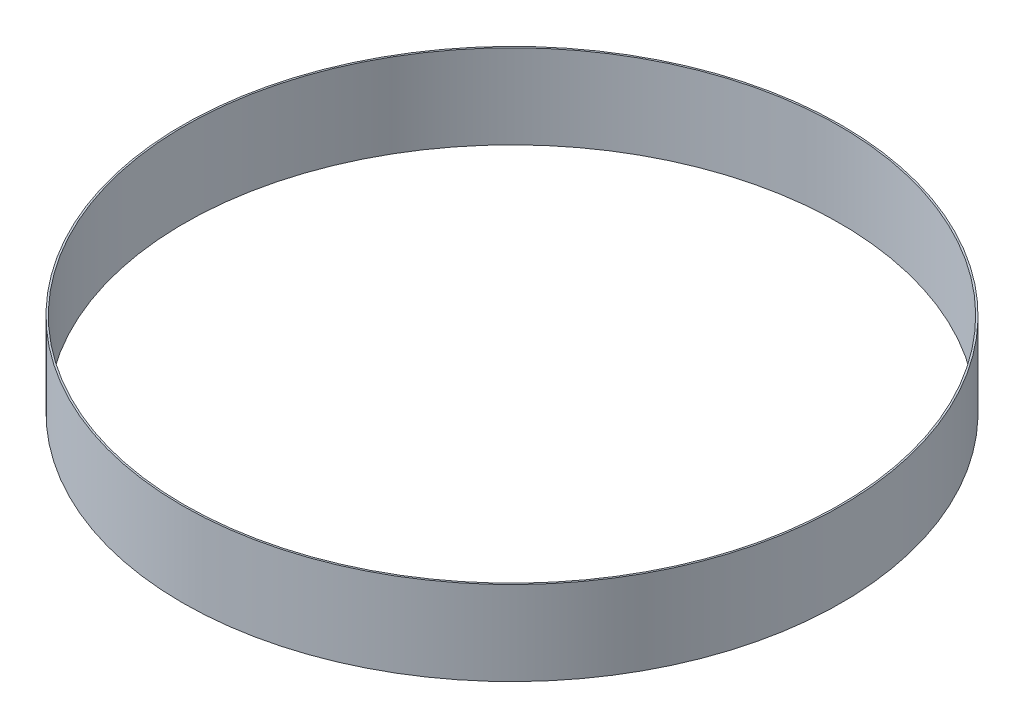
ISO-10303-21;
HEADER;
FILE_DESCRIPTION(('STEP AP214'),'2;1');
FILE_NAME('part.step','',(''),(''),'','','');
FILE_SCHEMA(('AUTOMOTIVE_DESIGN { 1 0 10303 214 1 1 1 1 }'));
ENDSEC;
DATA;
#1=APPLICATION_CONTEXT('core data for automotive mechanical design processes');
#2=APPLICATION_PROTOCOL_DEFINITION('international standard','automotive_design',2000,#1);
#3=PRODUCT_CONTEXT('',#1,'mechanical');
#4=PRODUCT('Part','Part','',(#3));
#5=PRODUCT_RELATED_PRODUCT_CATEGORY('part','',(#4));
#6=PRODUCT_DEFINITION_FORMATION('','',#4);
#7=PRODUCT_DEFINITION_CONTEXT('part definition',#1,'design');
#8=PRODUCT_DEFINITION('design','',#6,#7);
#9=PRODUCT_DEFINITION_SHAPE('','',#8);
#10=(LENGTH_UNIT() NAMED_UNIT(*) SI_UNIT(.MILLI.,.METRE.));
#11=(NAMED_UNIT(*) PLANE_ANGLE_UNIT() SI_UNIT($,.RADIAN.));
#12=(NAMED_UNIT(*) SI_UNIT($,.STERADIAN.) SOLID_ANGLE_UNIT());
#13=UNCERTAINTY_MEASURE_WITH_UNIT(LENGTH_MEASURE(1.E-05),#10,'distance_accuracy_value','');
#14=(GEOMETRIC_REPRESENTATION_CONTEXT(3) GLOBAL_UNCERTAINTY_ASSIGNED_CONTEXT((#13)) GLOBAL_UNIT_ASSIGNED_CONTEXT((#10,
#11,#12)) REPRESENTATION_CONTEXT('',''));
#15=CARTESIAN_POINT('',(0.,0.,0.));
#16=DIRECTION('',(0.,0.,1.));
#17=DIRECTION('',(1.,0.,0.));
#18=AXIS2_PLACEMENT_3D('',#15,#16,#17);
#19=CARTESIAN_POINT('',(0.,5.,0.));
#20=DIRECTION('',(0.,1.,0.));
#21=DIRECTION('',(0.,0.,1.));
#22=AXIS2_PLACEMENT_3D('',#19,#20,#21);
#23=PLANE('',#22);
#24=CARTESIAN_POINT('',(0.,5.,0.));
#25=DIRECTION('',(0.,1.,0.));
#26=DIRECTION('',(0.,0.,1.));
#27=AXIS2_PLACEMENT_3D('',#24,#25,#26);
#28=CIRCLE('',#27,19.6);
#29=CARTESIAN_POINT('',(0.,5.,19.6));
#30=VERTEX_POINT('',#29);
#31=EDGE_CURVE('E10',#30,#30,#28,.T.);
#32=ORIENTED_EDGE('',*,*,#31,.T.);
#33=EDGE_LOOP('',(#32));
#34=FACE_BOUND('',#33,.T.);
#35=CARTESIAN_POINT('',(0.,5.,0.));
#36=DIRECTION('',(0.,1.,0.));
#37=DIRECTION('',(0.,0.,1.));
#38=AXIS2_PLACEMENT_3D('',#35,#36,#37);
#39=CIRCLE('',#38,19.5);
#40=CARTESIAN_POINT('',(0.,5.,19.5));
#41=VERTEX_POINT('',#40);
#42=EDGE_CURVE('E50',#41,#41,#39,.T.);
#43=ORIENTED_EDGE('',*,*,#42,.F.);
#44=EDGE_LOOP('',(#43));
#45=FACE_BOUND('',#44,.T.);
#46=ADVANCED_FACE('F37',(#34,#45),#23,.T.);
#47=CARTESIAN_POINT('',(0.,0.,0.));
#48=DIRECTION('',(0.,1.,0.));
#49=DIRECTION('',(0.,0.,1.));
#50=AXIS2_PLACEMENT_3D('',#47,#48,#49);
#51=PLANE('',#50);
#52=CARTESIAN_POINT('',(0.,0.,0.));
#53=DIRECTION('',(0.,1.,0.));
#54=DIRECTION('',(0.,0.,1.));
#55=AXIS2_PLACEMENT_3D('',#52,#53,#54);
#56=CIRCLE('',#55,19.6);
#57=CARTESIAN_POINT('',(0.,0.,19.6));
#58=VERTEX_POINT('',#57);
#59=EDGE_CURVE('E41',#58,#58,#56,.T.);
#60=ORIENTED_EDGE('',*,*,#59,.F.);
#61=EDGE_LOOP('',(#60));
#62=FACE_BOUND('',#61,.T.);
#63=CARTESIAN_POINT('',(0.,0.,0.));
#64=DIRECTION('',(0.,1.,0.));
#65=DIRECTION('',(0.,0.,1.));
#66=AXIS2_PLACEMENT_3D('',#63,#64,#65);
#67=CIRCLE('',#66,19.5);
#68=CARTESIAN_POINT('',(0.,0.,19.5));
#69=VERTEX_POINT('',#68);
#70=EDGE_CURVE('E52',#69,#69,#67,.T.);
#71=ORIENTED_EDGE('',*,*,#70,.T.);
#72=EDGE_LOOP('',(#71));
#73=FACE_BOUND('',#72,.T.);
#74=ADVANCED_FACE('F64',(#62,#73),#51,.F.);
#75=CARTESIAN_POINT('',(0.,5.,0.));
#76=DIRECTION('',(0.,-1.,0.));
#77=DIRECTION('',(0.,0.,-1.));
#78=AXIS2_PLACEMENT_3D('',#75,#76,#77);
#79=CYLINDRICAL_SURFACE('',#78,19.6);
#80=ORIENTED_EDGE('',*,*,#31,.F.);
#81=EDGE_LOOP('',(#80));
#82=FACE_BOUND('',#81,.T.);
#83=ORIENTED_EDGE('',*,*,#59,.T.);
#84=EDGE_LOOP('',(#83));
#85=FACE_BOUND('',#84,.T.);
#86=ADVANCED_FACE('F39',(#82,#85),#79,.T.);
#87=CARTESIAN_POINT('',(0.,5.,0.));
#88=DIRECTION('',(0.,-1.,0.));
#89=DIRECTION('',(0.,0.,-1.));
#90=AXIS2_PLACEMENT_3D('',#87,#88,#89);
#91=CYLINDRICAL_SURFACE('',#90,19.5);
#92=ORIENTED_EDGE('',*,*,#42,.T.);
#93=EDGE_LOOP('',(#92));
#94=FACE_BOUND('',#93,.T.);
#95=ORIENTED_EDGE('',*,*,#70,.F.);
#96=EDGE_LOOP('',(#95));
#97=FACE_BOUND('',#96,.T.);
#98=ADVANCED_FACE('F60',(#94,#97),#91,.F.);
#99=CLOSED_SHELL('',(#46,#74,#86,#98));
#100=MANIFOLD_SOLID_BREP('B2',#99);
#101=ADVANCED_BREP_SHAPE_REPRESENTATION('',(#18,#100),#14);
#102=SHAPE_DEFINITION_REPRESENTATION(#9,#101);
ENDSEC;
END-ISO-10303-21;
